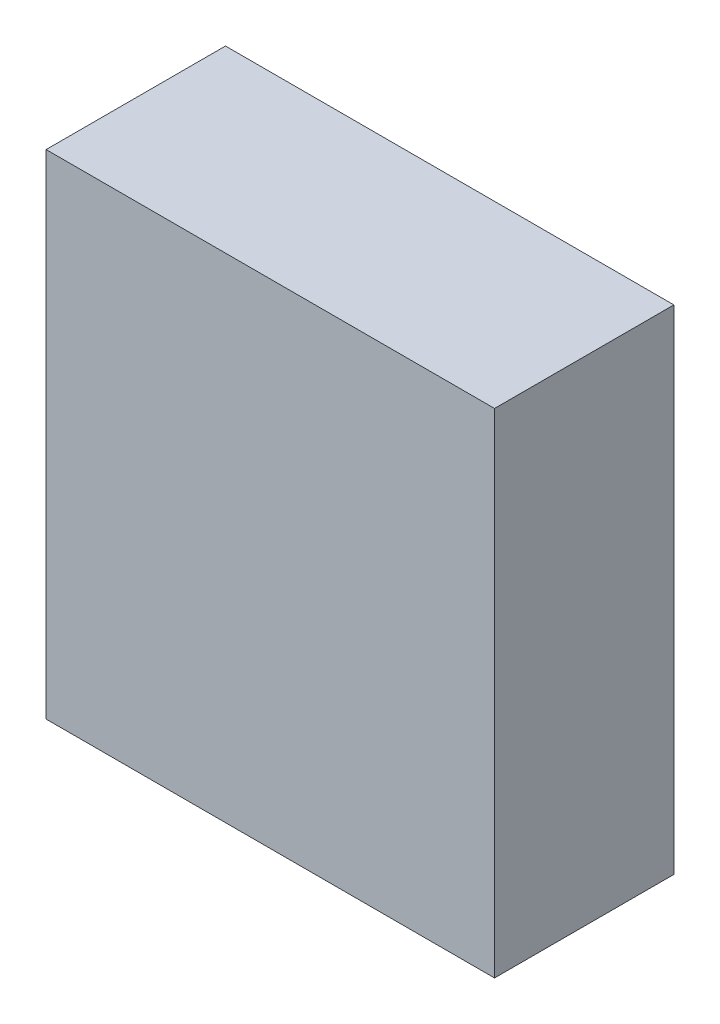
ISO-10303-21;
HEADER;
FILE_DESCRIPTION(('STEP AP214'),'2;1');
FILE_NAME('part.step','',(''),(''),'','','');
FILE_SCHEMA(('AUTOMOTIVE_DESIGN { 1 0 10303 214 1 1 1 1 }'));
ENDSEC;
DATA;
#1=APPLICATION_CONTEXT('core data for automotive mechanical design processes');
#2=APPLICATION_PROTOCOL_DEFINITION('international standard','automotive_design',2000,#1);
#3=PRODUCT_CONTEXT('',#1,'mechanical');
#4=PRODUCT('Part','Part','',(#3));
#5=PRODUCT_RELATED_PRODUCT_CATEGORY('part','',(#4));
#6=PRODUCT_DEFINITION_FORMATION('','',#4);
#7=PRODUCT_DEFINITION_CONTEXT('part definition',#1,'design');
#8=PRODUCT_DEFINITION('design','',#6,#7);
#9=PRODUCT_DEFINITION_SHAPE('','',#8);
#10=(LENGTH_UNIT() NAMED_UNIT(*) SI_UNIT(.MILLI.,.METRE.));
#11=(NAMED_UNIT(*) PLANE_ANGLE_UNIT() SI_UNIT($,.RADIAN.));
#12=(NAMED_UNIT(*) SI_UNIT($,.STERADIAN.) SOLID_ANGLE_UNIT());
#13=UNCERTAINTY_MEASURE_WITH_UNIT(LENGTH_MEASURE(1.E-05),#10,'distance_accuracy_value','');
#14=(GEOMETRIC_REPRESENTATION_CONTEXT(3) GLOBAL_UNCERTAINTY_ASSIGNED_CONTEXT((#13)) GLOBAL_UNIT_ASSIGNED_CONTEXT((#10,
#11,#12)) REPRESENTATION_CONTEXT('',''));
#15=CARTESIAN_POINT('',(0.,0.,0.));
#16=DIRECTION('',(0.,0.,1.));
#17=DIRECTION('',(1.,0.,0.));
#18=AXIS2_PLACEMENT_3D('',#15,#16,#17);
#19=CARTESIAN_POINT('',(240.,560.,-776.));
#20=DIRECTION('',(-1.,0.,0.));
#21=DIRECTION('',(0.,0.,1.));
#22=AXIS2_PLACEMENT_3D('',#19,#20,#21);
#23=PLANE('',#22);
#24=DIRECTION('',(0.,-1.,0.));
#25=VECTOR('',#24,1.);
#26=CARTESIAN_POINT('',(240.,560.,-736.));
#27=LINE('',#26,#25);
#28=CARTESIAN_POINT('',(240.,670.,-736.));
#29=VERTEX_POINT('',#28);
#30=CARTESIAN_POINT('',(240.,560.,-736.));
#31=VERTEX_POINT('',#30);
#32=EDGE_CURVE('E103',#29,#31,#27,.T.);
#33=ORIENTED_EDGE('',*,*,#32,.F.);
#34=DIRECTION('',(0.,0.,1.));
#35=VECTOR('',#34,1.);
#36=CARTESIAN_POINT('',(240.,670.,-776.));
#37=LINE('',#36,#35);
#38=CARTESIAN_POINT('',(240.,670.,-776.));
#39=VERTEX_POINT('',#38);
#40=EDGE_CURVE('E11',#39,#29,#37,.T.);
#41=ORIENTED_EDGE('',*,*,#40,.F.);
#42=DIRECTION('',(0.,-1.,0.));
#43=VECTOR('',#42,1.);
#44=CARTESIAN_POINT('',(240.,560.,-776.));
#45=LINE('',#44,#43);
#46=CARTESIAN_POINT('',(240.,560.,-776.));
#47=VERTEX_POINT('',#46);
#48=EDGE_CURVE('E97',#39,#47,#45,.T.);
#49=ORIENTED_EDGE('',*,*,#48,.T.);
#50=DIRECTION('',(0.,0.,1.));
#51=VECTOR('',#50,1.);
#52=CARTESIAN_POINT('',(240.,560.,-776.));
#53=LINE('',#52,#51);
#54=EDGE_CURVE('E42',#47,#31,#53,.T.);
#55=ORIENTED_EDGE('',*,*,#54,.T.);
#56=EDGE_LOOP('',(#33,#41,#49,#55));
#57=FACE_BOUND('',#56,.T.);
#58=ADVANCED_FACE('F39',(#57),#23,.T.);
#59=CARTESIAN_POINT('',(240.,670.,-776.));
#60=DIRECTION('',(0.,1.,0.));
#61=DIRECTION('',(0.,0.,1.));
#62=AXIS2_PLACEMENT_3D('',#59,#60,#61);
#63=PLANE('',#62);
#64=DIRECTION('',(-1.,0.,0.));
#65=VECTOR('',#64,1.);
#66=CARTESIAN_POINT('',(240.,670.,-736.));
#67=LINE('',#66,#65);
#68=CARTESIAN_POINT('',(340.,670.,-736.));
#69=VERTEX_POINT('',#68);
#70=EDGE_CURVE('E99',#69,#29,#67,.T.);
#71=ORIENTED_EDGE('',*,*,#70,.F.);
#72=DIRECTION('',(0.,0.,1.));
#73=VECTOR('',#72,1.);
#74=CARTESIAN_POINT('',(340.,670.,-776.));
#75=LINE('',#74,#73);
#76=CARTESIAN_POINT('',(340.,670.,-776.));
#77=VERTEX_POINT('',#76);
#78=EDGE_CURVE('E48',#77,#69,#75,.T.);
#79=ORIENTED_EDGE('',*,*,#78,.F.);
#80=DIRECTION('',(-1.,0.,0.));
#81=VECTOR('',#80,1.);
#82=CARTESIAN_POINT('',(240.,670.,-776.));
#83=LINE('',#82,#81);
#84=EDGE_CURVE('E94',#77,#39,#83,.T.);
#85=ORIENTED_EDGE('',*,*,#84,.T.);
#86=ORIENTED_EDGE('',*,*,#40,.T.);
#87=EDGE_LOOP('',(#71,#79,#85,#86));
#88=FACE_BOUND('',#87,.T.);
#89=ADVANCED_FACE('F113',(#88),#63,.T.);
#90=CARTESIAN_POINT('',(340.,560.,-776.));
#91=DIRECTION('',(1.,0.,0.));
#92=DIRECTION('',(0.,0.,-1.));
#93=AXIS2_PLACEMENT_3D('',#90,#91,#92);
#94=PLANE('',#93);
#95=DIRECTION('',(0.,1.,0.));
#96=VECTOR('',#95,1.);
#97=CARTESIAN_POINT('',(340.,560.,-736.));
#98=LINE('',#97,#96);
#99=CARTESIAN_POINT('',(340.,560.,-736.));
#100=VERTEX_POINT('',#99);
#101=EDGE_CURVE('E89',#100,#69,#98,.T.);
#102=ORIENTED_EDGE('',*,*,#101,.F.);
#103=DIRECTION('',(0.,0.,1.));
#104=VECTOR('',#103,1.);
#105=CARTESIAN_POINT('',(340.,560.,-776.));
#106=LINE('',#105,#104);
#107=CARTESIAN_POINT('',(340.,560.,-776.));
#108=VERTEX_POINT('',#107);
#109=EDGE_CURVE('E84',#108,#100,#106,.T.);
#110=ORIENTED_EDGE('',*,*,#109,.F.);
#111=DIRECTION('',(0.,1.,0.));
#112=VECTOR('',#111,1.);
#113=CARTESIAN_POINT('',(340.,560.,-776.));
#114=LINE('',#113,#112);
#115=EDGE_CURVE('E87',#108,#77,#114,.T.);
#116=ORIENTED_EDGE('',*,*,#115,.T.);
#117=ORIENTED_EDGE('',*,*,#78,.T.);
#118=EDGE_LOOP('',(#102,#110,#116,#117));
#119=FACE_BOUND('',#118,.T.);
#120=ADVANCED_FACE('F86',(#119),#94,.T.);
#121=CARTESIAN_POINT('',(240.,560.,-776.));
#122=DIRECTION('',(0.,-1.,0.));
#123=DIRECTION('',(0.,0.,-1.));
#124=AXIS2_PLACEMENT_3D('',#121,#122,#123);
#125=PLANE('',#124);
#126=DIRECTION('',(1.,0.,0.));
#127=VECTOR('',#126,1.);
#128=CARTESIAN_POINT('',(240.,560.,-736.));
#129=LINE('',#128,#127);
#130=EDGE_CURVE('E106',#31,#100,#129,.T.);
#131=ORIENTED_EDGE('',*,*,#130,.F.);
#132=ORIENTED_EDGE('',*,*,#54,.F.);
#133=DIRECTION('',(1.,0.,0.));
#134=VECTOR('',#133,1.);
#135=CARTESIAN_POINT('',(240.,560.,-776.));
#136=LINE('',#135,#134);
#137=EDGE_CURVE('E93',#47,#108,#136,.T.);
#138=ORIENTED_EDGE('',*,*,#137,.T.);
#139=ORIENTED_EDGE('',*,*,#109,.T.);
#140=EDGE_LOOP('',(#131,#132,#138,#139));
#141=FACE_BOUND('',#140,.T.);
#142=ADVANCED_FACE('F96',(#141),#125,.T.);
#143=CARTESIAN_POINT('',(0.,0.,-776.));
#144=DIRECTION('',(0.,0.,-1.));
#145=DIRECTION('',(-1.,0.,0.));
#146=AXIS2_PLACEMENT_3D('',#143,#144,#145);
#147=PLANE('',#146);
#148=ORIENTED_EDGE('',*,*,#48,.F.);
#149=ORIENTED_EDGE('',*,*,#84,.F.);
#150=ORIENTED_EDGE('',*,*,#115,.F.);
#151=ORIENTED_EDGE('',*,*,#137,.F.);
#152=EDGE_LOOP('',(#148,#149,#150,#151));
#153=FACE_BOUND('',#152,.T.);
#154=ADVANCED_FACE('F92',(#153),#147,.T.);
#155=CARTESIAN_POINT('',(0.,0.,-736.));
#156=DIRECTION('',(0.,0.,-1.));
#157=DIRECTION('',(-1.,0.,0.));
#158=AXIS2_PLACEMENT_3D('',#155,#156,#157);
#159=PLANE('',#158);
#160=ORIENTED_EDGE('',*,*,#32,.T.);
#161=ORIENTED_EDGE('',*,*,#130,.T.);
#162=ORIENTED_EDGE('',*,*,#101,.T.);
#163=ORIENTED_EDGE('',*,*,#70,.T.);
#164=EDGE_LOOP('',(#160,#161,#162,#163));
#165=FACE_BOUND('',#164,.T.);
#166=ADVANCED_FACE('F112',(#165),#159,.F.);
#167=CLOSED_SHELL('',(#58,#89,#120,#142,#154,#166));
#168=MANIFOLD_SOLID_BREP('B2',#167);
#169=ADVANCED_BREP_SHAPE_REPRESENTATION('',(#18,#168),#14);
#170=SHAPE_DEFINITION_REPRESENTATION(#9,#169);
ENDSEC;
END-ISO-10303-21;
